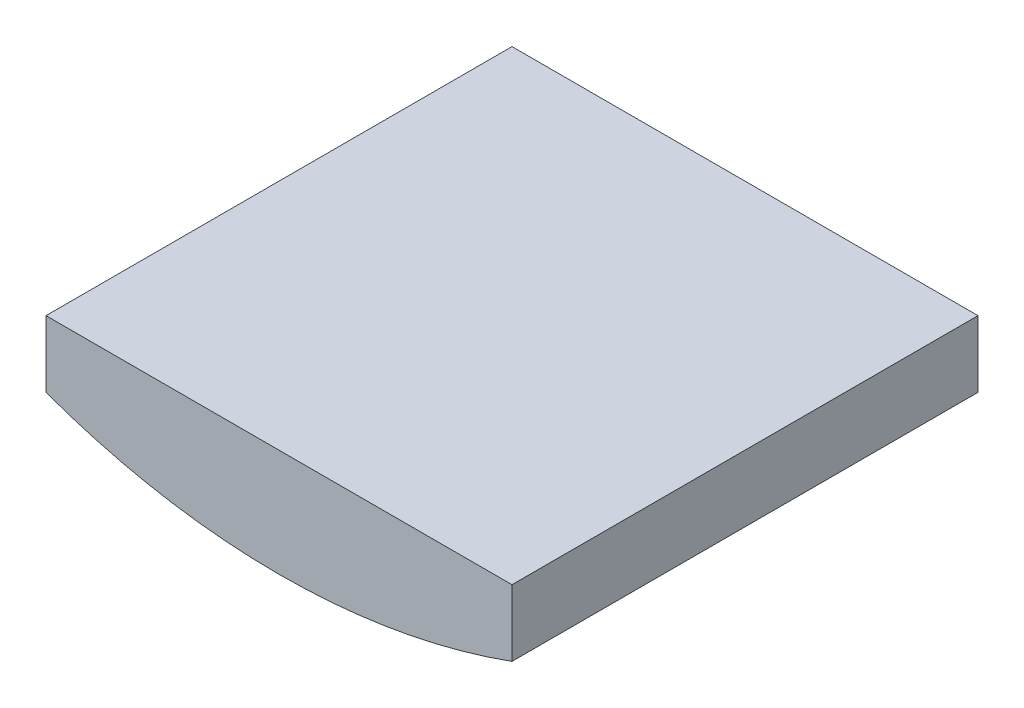
ISO-10303-21;
HEADER;
FILE_DESCRIPTION(('STEP AP214'),'2;1');
FILE_NAME('part.step','',(''),(''),'','','');
FILE_SCHEMA(('AUTOMOTIVE_DESIGN { 1 0 10303 214 1 1 1 1 }'));
ENDSEC;
DATA;
#1=APPLICATION_CONTEXT('core data for automotive mechanical design processes');
#2=APPLICATION_PROTOCOL_DEFINITION('international standard','automotive_design',2000,#1);
#3=PRODUCT_CONTEXT('',#1,'mechanical');
#4=PRODUCT('Part','Part','',(#3));
#5=PRODUCT_RELATED_PRODUCT_CATEGORY('part','',(#4));
#6=PRODUCT_DEFINITION_FORMATION('','',#4);
#7=PRODUCT_DEFINITION_CONTEXT('part definition',#1,'design');
#8=PRODUCT_DEFINITION('design','',#6,#7);
#9=PRODUCT_DEFINITION_SHAPE('','',#8);
#10=(LENGTH_UNIT() NAMED_UNIT(*) SI_UNIT(.MILLI.,.METRE.));
#11=(NAMED_UNIT(*) PLANE_ANGLE_UNIT() SI_UNIT($,.RADIAN.));
#12=(NAMED_UNIT(*) SI_UNIT($,.STERADIAN.) SOLID_ANGLE_UNIT());
#13=UNCERTAINTY_MEASURE_WITH_UNIT(LENGTH_MEASURE(1.E-05),#10,'distance_accuracy_value','');
#14=(GEOMETRIC_REPRESENTATION_CONTEXT(3) GLOBAL_UNCERTAINTY_ASSIGNED_CONTEXT((#13)) GLOBAL_UNIT_ASSIGNED_CONTEXT((#10,
#11,#12)) REPRESENTATION_CONTEXT('',''));
#15=CARTESIAN_POINT('',(0.,0.,0.));
#16=DIRECTION('',(0.,0.,1.));
#17=DIRECTION('',(1.,0.,0.));
#18=AXIS2_PLACEMENT_3D('',#15,#16,#17);
#19=CARTESIAN_POINT('',(-32.5,15.,65.));
#20=DIRECTION('',(1.,0.,0.));
#21=DIRECTION('',(0.,0.,-1.));
#22=AXIS2_PLACEMENT_3D('',#19,#20,#21);
#23=PLANE('',#22);
#24=DIRECTION('',(0.,0.,1.));
#25=VECTOR('',#24,1.);
#26=CARTESIAN_POINT('',(-32.5,5.73214464321435,0.));
#27=LINE('',#26,#25);
#28=CARTESIAN_POINT('',(-32.5,5.73214464321435,65.));
#29=VERTEX_POINT('',#28);
#30=CARTESIAN_POINT('',(-32.5,5.73214464321435,0.));
#31=VERTEX_POINT('',#30);
#32=EDGE_CURVE('E49',#29,#31,#27,.F.);
#33=ORIENTED_EDGE('',*,*,#32,.F.);
#34=DIRECTION('',(0.,-1.,0.));
#35=VECTOR('',#34,1.);
#36=CARTESIAN_POINT('',(-32.5,15.,65.));
#37=LINE('',#36,#35);
#38=CARTESIAN_POINT('',(-32.5,15.,65.));
#39=VERTEX_POINT('',#38);
#40=EDGE_CURVE('E78',#39,#29,#37,.T.);
#41=ORIENTED_EDGE('',*,*,#40,.F.);
#42=DIRECTION('',(0.,0.,-1.));
#43=VECTOR('',#42,1.);
#44=CARTESIAN_POINT('',(-32.5,15.,65.));
#45=LINE('',#44,#43);
#46=CARTESIAN_POINT('',(-32.5,15.,0.));
#47=VERTEX_POINT('',#46);
#48=EDGE_CURVE('E42',#39,#47,#45,.T.);
#49=ORIENTED_EDGE('',*,*,#48,.T.);
#50=DIRECTION('',(0.,-1.,0.));
#51=VECTOR('',#50,1.);
#52=CARTESIAN_POINT('',(-32.5,15.,0.));
#53=LINE('',#52,#51);
#54=EDGE_CURVE('E83',#47,#31,#53,.T.);
#55=ORIENTED_EDGE('',*,*,#54,.T.);
#56=EDGE_LOOP('',(#33,#41,#49,#55));
#57=FACE_BOUND('',#56,.T.);
#58=ADVANCED_FACE('F35',(#57),#23,.F.);
#59=CARTESIAN_POINT('',(32.5,15.,65.));
#60=DIRECTION('',(-1.,0.,0.));
#61=DIRECTION('',(0.,0.,1.));
#62=AXIS2_PLACEMENT_3D('',#59,#60,#61);
#63=PLANE('',#62);
#64=DIRECTION('',(0.,0.,1.));
#65=VECTOR('',#64,1.);
#66=CARTESIAN_POINT('',(32.5,5.73214464321435,0.));
#67=LINE('',#66,#65);
#68=CARTESIAN_POINT('',(32.5,5.73214464321435,0.));
#69=VERTEX_POINT('',#68);
#70=CARTESIAN_POINT('',(32.5,5.73214464321435,65.));
#71=VERTEX_POINT('',#70);
#72=EDGE_CURVE('E88',#69,#71,#67,.T.);
#73=ORIENTED_EDGE('',*,*,#72,.F.);
#74=DIRECTION('',(0.,1.,0.));
#75=VECTOR('',#74,1.);
#76=CARTESIAN_POINT('',(32.5,15.,0.));
#77=LINE('',#76,#75);
#78=CARTESIAN_POINT('',(32.5,15.,0.));
#79=VERTEX_POINT('',#78);
#80=EDGE_CURVE('E79',#69,#79,#77,.T.);
#81=ORIENTED_EDGE('',*,*,#80,.T.);
#82=DIRECTION('',(0.,0.,-1.));
#83=VECTOR('',#82,1.);
#84=CARTESIAN_POINT('',(32.5,15.,65.));
#85=LINE('',#84,#83);
#86=CARTESIAN_POINT('',(32.5,15.,65.));
#87=VERTEX_POINT('',#86);
#88=EDGE_CURVE('E12',#87,#79,#85,.T.);
#89=ORIENTED_EDGE('',*,*,#88,.F.);
#90=DIRECTION('',(0.,1.,0.));
#91=VECTOR('',#90,1.);
#92=CARTESIAN_POINT('',(32.5,15.,65.));
#93=LINE('',#92,#91);
#94=EDGE_CURVE('E92',#71,#87,#93,.T.);
#95=ORIENTED_EDGE('',*,*,#94,.F.);
#96=EDGE_LOOP('',(#73,#81,#89,#95));
#97=FACE_BOUND('',#96,.T.);
#98=ADVANCED_FACE('F107',(#97),#63,.F.);
#99=CARTESIAN_POINT('',(0.,0.,65.));
#100=DIRECTION('',(0.,0.,1.));
#101=DIRECTION('',(1.,0.,0.));
#102=AXIS2_PLACEMENT_3D('',#99,#100,#101);
#103=PLANE('',#102);
#104=ORIENTED_EDGE('',*,*,#40,.T.);
#105=CARTESIAN_POINT('',(0.,95.,65.));
#106=DIRECTION('',(0.,0.,1.));
#107=DIRECTION('',(1.,0.,0.));
#108=AXIS2_PLACEMENT_3D('',#105,#106,#107);
#109=CIRCLE('',#108,95.);
#110=EDGE_CURVE('E97',#29,#71,#109,.T.);
#111=ORIENTED_EDGE('',*,*,#110,.T.);
#112=ORIENTED_EDGE('',*,*,#94,.T.);
#113=DIRECTION('',(-1.,0.,0.));
#114=VECTOR('',#113,1.);
#115=CARTESIAN_POINT('',(-32.5,15.,65.));
#116=LINE('',#115,#114);
#117=EDGE_CURVE('E58',#87,#39,#116,.T.);
#118=ORIENTED_EDGE('',*,*,#117,.T.);
#119=EDGE_LOOP('',(#104,#111,#112,#118));
#120=FACE_BOUND('',#119,.T.);
#121=ADVANCED_FACE('F108',(#120),#103,.T.);
#122=CARTESIAN_POINT('',(0.,0.,0.));
#123=DIRECTION('',(0.,0.,1.));
#124=DIRECTION('',(1.,0.,0.));
#125=AXIS2_PLACEMENT_3D('',#122,#123,#124);
#126=PLANE('',#125);
#127=CARTESIAN_POINT('',(0.,95.,0.));
#128=DIRECTION('',(0.,0.,1.));
#129=DIRECTION('',(1.,0.,0.));
#130=AXIS2_PLACEMENT_3D('',#127,#128,#129);
#131=CIRCLE('',#130,95.);
#132=EDGE_CURVE('E85',#31,#69,#131,.T.);
#133=ORIENTED_EDGE('',*,*,#132,.F.);
#134=ORIENTED_EDGE('',*,*,#54,.F.);
#135=DIRECTION('',(-1.,0.,0.));
#136=VECTOR('',#135,1.);
#137=CARTESIAN_POINT('',(-32.5,15.,0.));
#138=LINE('',#137,#136);
#139=EDGE_CURVE('E70',#79,#47,#138,.T.);
#140=ORIENTED_EDGE('',*,*,#139,.F.);
#141=ORIENTED_EDGE('',*,*,#80,.F.);
#142=EDGE_LOOP('',(#133,#134,#140,#141));
#143=FACE_BOUND('',#142,.T.);
#144=ADVANCED_FACE('F84',(#143),#126,.F.);
#145=CARTESIAN_POINT('',(-32.5,15.,65.));
#146=DIRECTION('',(0.,-1.,0.));
#147=DIRECTION('',(0.,0.,-1.));
#148=AXIS2_PLACEMENT_3D('',#145,#146,#147);
#149=PLANE('',#148);
#150=ORIENTED_EDGE('',*,*,#139,.T.);
#151=ORIENTED_EDGE('',*,*,#48,.F.);
#152=ORIENTED_EDGE('',*,*,#117,.F.);
#153=ORIENTED_EDGE('',*,*,#88,.T.);
#154=EDGE_LOOP('',(#150,#151,#152,#153));
#155=FACE_BOUND('',#154,.T.);
#156=ADVANCED_FACE('F72',(#155),#149,.F.);
#157=CARTESIAN_POINT('',(0.,95.,0.));
#158=DIRECTION('',(0.,0.,1.));
#159=DIRECTION('',(1.,0.,0.));
#160=AXIS2_PLACEMENT_3D('',#157,#158,#159);
#161=CYLINDRICAL_SURFACE('',#160,95.);
#162=ORIENTED_EDGE('',*,*,#32,.T.);
#163=ORIENTED_EDGE('',*,*,#132,.T.);
#164=ORIENTED_EDGE('',*,*,#72,.T.);
#165=ORIENTED_EDGE('',*,*,#110,.F.);
#166=EDGE_LOOP('',(#162,#163,#164,#165));
#167=FACE_BOUND('',#166,.T.);
#168=ADVANCED_FACE('F102',(#167),#161,.T.);
#169=CLOSED_SHELL('',(#58,#98,#121,#144,#156,#168));
#170=MANIFOLD_SOLID_BREP('B2',#169);
#171=ADVANCED_BREP_SHAPE_REPRESENTATION('',(#18,#170),#14);
#172=SHAPE_DEFINITION_REPRESENTATION(#9,#171);
ENDSEC;
END-ISO-10303-21;
